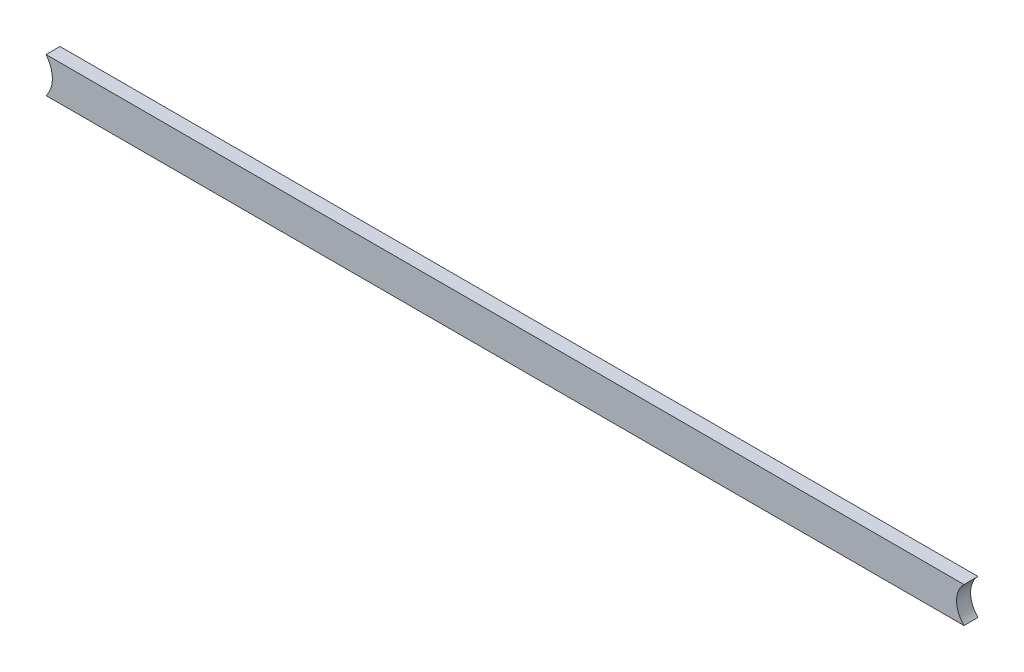
ISO-10303-21;
HEADER;
FILE_DESCRIPTION(('STEP AP214'),'2;1');
FILE_NAME('part.step','',(''),(''),'','','');
FILE_SCHEMA(('AUTOMOTIVE_DESIGN { 1 0 10303 214 1 1 1 1 }'));
ENDSEC;
DATA;
#1=APPLICATION_CONTEXT('core data for automotive mechanical design processes');
#2=APPLICATION_PROTOCOL_DEFINITION('international standard','automotive_design',2000,#1);
#3=PRODUCT_CONTEXT('',#1,'mechanical');
#4=PRODUCT('Part','Part','',(#3));
#5=PRODUCT_RELATED_PRODUCT_CATEGORY('part','',(#4));
#6=PRODUCT_DEFINITION_FORMATION('','',#4);
#7=PRODUCT_DEFINITION_CONTEXT('part definition',#1,'design');
#8=PRODUCT_DEFINITION('design','',#6,#7);
#9=PRODUCT_DEFINITION_SHAPE('','',#8);
#10=(LENGTH_UNIT() NAMED_UNIT(*) SI_UNIT(.MILLI.,.METRE.));
#11=(NAMED_UNIT(*) PLANE_ANGLE_UNIT() SI_UNIT($,.RADIAN.));
#12=(NAMED_UNIT(*) SI_UNIT($,.STERADIAN.) SOLID_ANGLE_UNIT());
#13=UNCERTAINTY_MEASURE_WITH_UNIT(LENGTH_MEASURE(1.E-05),#10,'distance_accuracy_value','');
#14=(GEOMETRIC_REPRESENTATION_CONTEXT(3) GLOBAL_UNCERTAINTY_ASSIGNED_CONTEXT((#13)) GLOBAL_UNIT_ASSIGNED_CONTEXT((#10,
#11,#12)) REPRESENTATION_CONTEXT('',''));
#15=CARTESIAN_POINT('',(0.,0.,0.));
#16=DIRECTION('',(0.,0.,1.));
#17=DIRECTION('',(1.,0.,0.));
#18=AXIS2_PLACEMENT_3D('',#15,#16,#17);
#19=CARTESIAN_POINT('',(112.831003818748,67.564,0.));
#20=DIRECTION('',(0.,1.,0.));
#21=DIRECTION('',(1.,0.,0.));
#22=AXIS2_PLACEMENT_3D('',#19,#20,#21);
#23=PLANE('',#22);
#24=DIRECTION('',(1.,0.,0.));
#25=VECTOR('',#24,1.);
#26=CARTESIAN_POINT('',(112.522,67.564,0.1999996));
#27=LINE('',#26,#25);
#28=CARTESIAN_POINT('',(112.831003818748,67.564,0.1999996));
#29=VERTEX_POINT('',#28);
#30=CARTESIAN_POINT('',(125.963731842133,67.564,0.1999996));
#31=VERTEX_POINT('',#30);
#32=EDGE_CURVE('E11',#29,#31,#27,.T.);
#33=ORIENTED_EDGE('',*,*,#32,.F.);
#34=DIRECTION('',(0.,0.,1.));
#35=VECTOR('',#34,1.);
#36=CARTESIAN_POINT('',(112.831003818748,67.564,0.));
#37=LINE('',#36,#35);
#38=CARTESIAN_POINT('',(112.831003818748,67.564,0.));
#39=VERTEX_POINT('',#38);
#40=EDGE_CURVE('E24',#39,#29,#37,.T.);
#41=ORIENTED_EDGE('',*,*,#40,.F.);
#42=DIRECTION('',(1.,0.,0.));
#43=VECTOR('',#42,1.);
#44=CARTESIAN_POINT('',(112.522,67.564,0.));
#45=LINE('',#44,#43);
#46=CARTESIAN_POINT('',(125.963731842133,67.564,0.));
#47=VERTEX_POINT('',#46);
#48=EDGE_CURVE('E82',#39,#47,#45,.T.);
#49=ORIENTED_EDGE('',*,*,#48,.T.);
#50=DIRECTION('',(0.,0.,1.));
#51=VECTOR('',#50,1.);
#52=CARTESIAN_POINT('',(125.963731842133,67.564,0.));
#53=LINE('',#52,#51);
#54=EDGE_CURVE('E37',#47,#31,#53,.T.);
#55=ORIENTED_EDGE('',*,*,#54,.T.);
#56=EDGE_LOOP('',(#33,#41,#49,#55));
#57=FACE_BOUND('',#56,.T.);
#58=ADVANCED_FACE('F17',(#57),#23,.F.);
#59=CARTESIAN_POINT('',(126.2126,67.818,0.));
#60=DIRECTION('',(0.,0.,-1.));
#61=DIRECTION('',(1.,0.,0.));
#62=AXIS2_PLACEMENT_3D('',#59,#60,#61);
#63=CYLINDRICAL_SURFACE('',#62,0.3556);
#64=DIRECTION('',(0.,0.,1.));
#65=VECTOR('',#64,1.);
#66=CARTESIAN_POINT('',(125.963731842133,68.072,0.));
#67=LINE('',#66,#65);
#68=CARTESIAN_POINT('',(125.963731842133,68.072,0.));
#69=VERTEX_POINT('',#68);
#70=CARTESIAN_POINT('',(125.963731842133,68.072,0.1999996));
#71=VERTEX_POINT('',#70);
#72=EDGE_CURVE('E97',#69,#71,#67,.T.);
#73=ORIENTED_EDGE('',*,*,#72,.T.);
#74=CARTESIAN_POINT('',(126.2126,67.818,0.1999996));
#75=DIRECTION('',(0.,0.,1.));
#76=DIRECTION('',(1.,0.,0.));
#77=AXIS2_PLACEMENT_3D('',#74,#75,#76);
#78=CIRCLE('',#77,0.3556);
#79=EDGE_CURVE('E94',#71,#31,#78,.T.);
#80=ORIENTED_EDGE('',*,*,#79,.T.);
#81=ORIENTED_EDGE('',*,*,#54,.F.);
#82=CARTESIAN_POINT('',(126.2126,67.818,0.));
#83=DIRECTION('',(0.,0.,1.));
#84=DIRECTION('',(1.,0.,0.));
#85=AXIS2_PLACEMENT_3D('',#82,#83,#84);
#86=CIRCLE('',#85,0.3556);
#87=EDGE_CURVE('E92',#69,#47,#86,.T.);
#88=ORIENTED_EDGE('',*,*,#87,.F.);
#89=EDGE_LOOP('',(#73,#80,#81,#88));
#90=FACE_BOUND('',#89,.T.);
#91=ADVANCED_FACE('F102',(#90),#63,.F.);
#92=CARTESIAN_POINT('',(125.963731842133,68.072,0.));
#93=DIRECTION('',(0.,-1.,0.));
#94=DIRECTION('',(-1.,0.,0.));
#95=AXIS2_PLACEMENT_3D('',#92,#93,#94);
#96=PLANE('',#95);
#97=DIRECTION('',(-1.,0.,0.));
#98=VECTOR('',#97,1.);
#99=CARTESIAN_POINT('',(126.2126,68.072,0.1999996));
#100=LINE('',#99,#98);
#101=CARTESIAN_POINT('',(112.831003818748,68.072,0.1999996));
#102=VERTEX_POINT('',#101);
#103=EDGE_CURVE('E89',#71,#102,#100,.T.);
#104=ORIENTED_EDGE('',*,*,#103,.F.);
#105=ORIENTED_EDGE('',*,*,#72,.F.);
#106=DIRECTION('',(-1.,0.,0.));
#107=VECTOR('',#106,1.);
#108=CARTESIAN_POINT('',(126.2126,68.072,0.));
#109=LINE('',#108,#107);
#110=CARTESIAN_POINT('',(112.831003818748,68.072,0.));
#111=VERTEX_POINT('',#110);
#112=EDGE_CURVE('E87',#69,#111,#109,.T.);
#113=ORIENTED_EDGE('',*,*,#112,.T.);
#114=DIRECTION('',(0.,0.,1.));
#115=VECTOR('',#114,1.);
#116=CARTESIAN_POINT('',(112.831003818748,68.072,0.));
#117=LINE('',#116,#115);
#118=EDGE_CURVE('E69',#111,#102,#117,.T.);
#119=ORIENTED_EDGE('',*,*,#118,.T.);
#120=EDGE_LOOP('',(#104,#105,#113,#119));
#121=FACE_BOUND('',#120,.T.);
#122=ADVANCED_FACE('F108',(#121),#96,.F.);
#123=CARTESIAN_POINT('',(112.522,67.818,0.));
#124=DIRECTION('',(0.,0.,-1.));
#125=DIRECTION('',(1.,0.,0.));
#126=AXIS2_PLACEMENT_3D('',#123,#124,#125);
#127=CYLINDRICAL_SURFACE('',#126,0.3999992);
#128=DIRECTION('',(0.,0.,1.));
#129=VECTOR('',#128,1.);
#130=CARTESIAN_POINT('',(112.9219992,67.818,0.));
#131=LINE('',#130,#129);
#132=CARTESIAN_POINT('',(112.9219992,67.818,0.));
#133=VERTEX_POINT('',#132);
#134=CARTESIAN_POINT('',(112.9219992,67.818,0.1999996));
#135=VERTEX_POINT('',#134);
#136=EDGE_CURVE('E59',#133,#135,#131,.T.);
#137=ORIENTED_EDGE('',*,*,#136,.T.);
#138=CARTESIAN_POINT('',(112.522,67.818,0.1999996));
#139=DIRECTION('',(0.,0.,1.));
#140=DIRECTION('',(1.,0.,0.));
#141=AXIS2_PLACEMENT_3D('',#138,#139,#140);
#142=CIRCLE('',#141,0.3999992);
#143=EDGE_CURVE('E70',#135,#102,#142,.T.);
#144=ORIENTED_EDGE('',*,*,#143,.T.);
#145=ORIENTED_EDGE('',*,*,#118,.F.);
#146=CARTESIAN_POINT('',(112.522,67.818,0.));
#147=DIRECTION('',(0.,0.,1.));
#148=DIRECTION('',(1.,0.,0.));
#149=AXIS2_PLACEMENT_3D('',#146,#147,#148);
#150=CIRCLE('',#149,0.3999992);
#151=EDGE_CURVE('E73',#133,#111,#150,.T.);
#152=ORIENTED_EDGE('',*,*,#151,.F.);
#153=EDGE_LOOP('',(#137,#144,#145,#152));
#154=FACE_BOUND('',#153,.T.);
#155=ADVANCED_FACE('F74',(#154),#127,.F.);
#156=CARTESIAN_POINT('',(112.522,67.818,0.));
#157=DIRECTION('',(0.,0.,-1.));
#158=DIRECTION('',(1.,0.,0.));
#159=AXIS2_PLACEMENT_3D('',#156,#157,#158);
#160=CYLINDRICAL_SURFACE('',#159,0.3999992);
#161=ORIENTED_EDGE('',*,*,#40,.T.);
#162=CARTESIAN_POINT('',(112.522,67.818,0.1999996));
#163=DIRECTION('',(0.,0.,1.));
#164=DIRECTION('',(1.,0.,0.));
#165=AXIS2_PLACEMENT_3D('',#162,#163,#164);
#166=CIRCLE('',#165,0.3999992);
#167=EDGE_CURVE('E65',#29,#135,#166,.T.);
#168=ORIENTED_EDGE('',*,*,#167,.T.);
#169=ORIENTED_EDGE('',*,*,#136,.F.);
#170=EDGE_CURVE('E63',#39,#133,#150,.T.);
#171=ORIENTED_EDGE('',*,*,#170,.F.);
#172=EDGE_LOOP('',(#161,#168,#169,#171));
#173=FACE_BOUND('',#172,.T.);
#174=ADVANCED_FACE('F61',(#173),#160,.F.);
#175=CARTESIAN_POINT('',(112.522,67.564,0.));
#176=DIRECTION('',(0.,0.,-1.));
#177=DIRECTION('',(-1.,0.,0.));
#178=AXIS2_PLACEMENT_3D('',#175,#176,#177);
#179=PLANE('',#178);
#180=ORIENTED_EDGE('',*,*,#48,.F.);
#181=ORIENTED_EDGE('',*,*,#170,.T.);
#182=ORIENTED_EDGE('',*,*,#151,.T.);
#183=ORIENTED_EDGE('',*,*,#112,.F.);
#184=ORIENTED_EDGE('',*,*,#87,.T.);
#185=EDGE_LOOP('',(#180,#181,#182,#183,#184));
#186=FACE_BOUND('',#185,.T.);
#187=ADVANCED_FACE('F80',(#186),#179,.T.);
#188=CARTESIAN_POINT('',(112.522,67.564,0.1999996));
#189=DIRECTION('',(0.,0.,-1.));
#190=DIRECTION('',(-1.,0.,0.));
#191=AXIS2_PLACEMENT_3D('',#188,#189,#190);
#192=PLANE('',#191);
#193=ORIENTED_EDGE('',*,*,#167,.F.);
#194=ORIENTED_EDGE('',*,*,#32,.T.);
#195=ORIENTED_EDGE('',*,*,#79,.F.);
#196=ORIENTED_EDGE('',*,*,#103,.T.);
#197=ORIENTED_EDGE('',*,*,#143,.F.);
#198=EDGE_LOOP('',(#193,#194,#195,#196,#197));
#199=FACE_BOUND('',#198,.T.);
#200=ADVANCED_FACE('F106',(#199),#192,.F.);
#201=CLOSED_SHELL('',(#58,#91,#122,#155,#174,#187,#200));
#202=MANIFOLD_SOLID_BREP('B1',#201);
#203=ADVANCED_BREP_SHAPE_REPRESENTATION('',(#18,#202),#14);
#204=SHAPE_DEFINITION_REPRESENTATION(#9,#203);
ENDSEC;
END-ISO-10303-21;
